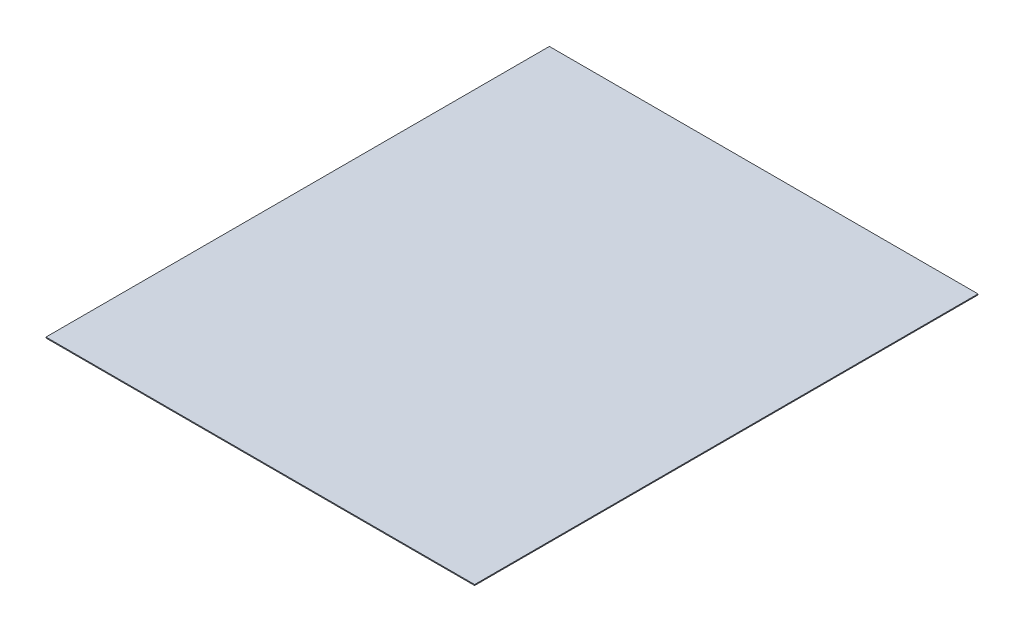
ISO-10303-21;
HEADER;
FILE_DESCRIPTION(('STEP AP214'),'2;1');
FILE_NAME('part.step','',(''),(''),'','','');
FILE_SCHEMA(('AUTOMOTIVE_DESIGN { 1 0 10303 214 1 1 1 1 }'));
ENDSEC;
DATA;
#1=APPLICATION_CONTEXT('core data for automotive mechanical design processes');
#2=APPLICATION_PROTOCOL_DEFINITION('international standard','automotive_design',2000,#1);
#3=PRODUCT_CONTEXT('',#1,'mechanical');
#4=PRODUCT('Part','Part','',(#3));
#5=PRODUCT_RELATED_PRODUCT_CATEGORY('part','',(#4));
#6=PRODUCT_DEFINITION_FORMATION('','',#4);
#7=PRODUCT_DEFINITION_CONTEXT('part definition',#1,'design');
#8=PRODUCT_DEFINITION('design','',#6,#7);
#9=PRODUCT_DEFINITION_SHAPE('','',#8);
#10=(LENGTH_UNIT() NAMED_UNIT(*) SI_UNIT(.MILLI.,.METRE.));
#11=(NAMED_UNIT(*) PLANE_ANGLE_UNIT() SI_UNIT($,.RADIAN.));
#12=(NAMED_UNIT(*) SI_UNIT($,.STERADIAN.) SOLID_ANGLE_UNIT());
#13=UNCERTAINTY_MEASURE_WITH_UNIT(LENGTH_MEASURE(1.E-05),#10,'distance_accuracy_value','');
#14=(GEOMETRIC_REPRESENTATION_CONTEXT(3) GLOBAL_UNCERTAINTY_ASSIGNED_CONTEXT((#13)) GLOBAL_UNIT_ASSIGNED_CONTEXT((#10,
#11,#12)) REPRESENTATION_CONTEXT('',''));
#15=CARTESIAN_POINT('',(0.,0.,0.));
#16=DIRECTION('',(0.,0.,1.));
#17=DIRECTION('',(1.,0.,0.));
#18=AXIS2_PLACEMENT_3D('',#15,#16,#17);
#19=CARTESIAN_POINT('',(1.5,200.,-818.5));
#20=DIRECTION('',(-1.,0.,0.));
#21=DIRECTION('',(0.,0.,1.));
#22=AXIS2_PLACEMENT_3D('',#19,#20,#21);
#23=PLANE('',#22);
#24=DIRECTION('',(0.,-1.,0.));
#25=VECTOR('',#24,1.);
#26=CARTESIAN_POINT('',(1.5,200.,0.));
#27=LINE('',#26,#25);
#28=CARTESIAN_POINT('',(1.5,201.5,0.));
#29=VERTEX_POINT('',#28);
#30=CARTESIAN_POINT('',(1.5,200.,0.));
#31=VERTEX_POINT('',#30);
#32=EDGE_CURVE('E103',#29,#31,#27,.T.);
#33=ORIENTED_EDGE('',*,*,#32,.F.);
#34=DIRECTION('',(0.,0.,1.));
#35=VECTOR('',#34,1.);
#36=CARTESIAN_POINT('',(1.5,201.5,-818.5));
#37=LINE('',#36,#35);
#38=CARTESIAN_POINT('',(1.5,201.5,-818.5));
#39=VERTEX_POINT('',#38);
#40=EDGE_CURVE('E11',#39,#29,#37,.T.);
#41=ORIENTED_EDGE('',*,*,#40,.F.);
#42=DIRECTION('',(0.,-1.,0.));
#43=VECTOR('',#42,1.);
#44=CARTESIAN_POINT('',(1.5,200.,-818.5));
#45=LINE('',#44,#43);
#46=CARTESIAN_POINT('',(1.5,200.,-818.5));
#47=VERTEX_POINT('',#46);
#48=EDGE_CURVE('E97',#39,#47,#45,.T.);
#49=ORIENTED_EDGE('',*,*,#48,.T.);
#50=DIRECTION('',(0.,0.,1.));
#51=VECTOR('',#50,1.);
#52=CARTESIAN_POINT('',(1.5,200.,-818.5));
#53=LINE('',#52,#51);
#54=EDGE_CURVE('E42',#47,#31,#53,.T.);
#55=ORIENTED_EDGE('',*,*,#54,.T.);
#56=EDGE_LOOP('',(#33,#41,#49,#55));
#57=FACE_BOUND('',#56,.T.);
#58=ADVANCED_FACE('F39',(#57),#23,.T.);
#59=CARTESIAN_POINT('',(1.5,201.5,-818.5));
#60=DIRECTION('',(0.,1.,0.));
#61=DIRECTION('',(0.,0.,1.));
#62=AXIS2_PLACEMENT_3D('',#59,#60,#61);
#63=PLANE('',#62);
#64=DIRECTION('',(-1.,0.,0.));
#65=VECTOR('',#64,1.);
#66=CARTESIAN_POINT('',(1.5,201.5,0.));
#67=LINE('',#66,#65);
#68=CARTESIAN_POINT('',(698.5,201.5,0.));
#69=VERTEX_POINT('',#68);
#70=EDGE_CURVE('E99',#69,#29,#67,.T.);
#71=ORIENTED_EDGE('',*,*,#70,.F.);
#72=DIRECTION('',(0.,0.,1.));
#73=VECTOR('',#72,1.);
#74=CARTESIAN_POINT('',(698.5,201.5,-818.5));
#75=LINE('',#74,#73);
#76=CARTESIAN_POINT('',(698.5,201.5,-818.5));
#77=VERTEX_POINT('',#76);
#78=EDGE_CURVE('E48',#77,#69,#75,.T.);
#79=ORIENTED_EDGE('',*,*,#78,.F.);
#80=DIRECTION('',(-1.,0.,0.));
#81=VECTOR('',#80,1.);
#82=CARTESIAN_POINT('',(1.5,201.5,-818.5));
#83=LINE('',#82,#81);
#84=EDGE_CURVE('E94',#77,#39,#83,.T.);
#85=ORIENTED_EDGE('',*,*,#84,.T.);
#86=ORIENTED_EDGE('',*,*,#40,.T.);
#87=EDGE_LOOP('',(#71,#79,#85,#86));
#88=FACE_BOUND('',#87,.T.);
#89=ADVANCED_FACE('F113',(#88),#63,.T.);
#90=CARTESIAN_POINT('',(698.5,200.,-818.5));
#91=DIRECTION('',(1.,0.,0.));
#92=DIRECTION('',(0.,0.,-1.));
#93=AXIS2_PLACEMENT_3D('',#90,#91,#92);
#94=PLANE('',#93);
#95=DIRECTION('',(0.,1.,0.));
#96=VECTOR('',#95,1.);
#97=CARTESIAN_POINT('',(698.5,200.,0.));
#98=LINE('',#97,#96);
#99=CARTESIAN_POINT('',(698.5,200.,0.));
#100=VERTEX_POINT('',#99);
#101=EDGE_CURVE('E89',#100,#69,#98,.T.);
#102=ORIENTED_EDGE('',*,*,#101,.F.);
#103=DIRECTION('',(0.,0.,1.));
#104=VECTOR('',#103,1.);
#105=CARTESIAN_POINT('',(698.5,200.,-818.5));
#106=LINE('',#105,#104);
#107=CARTESIAN_POINT('',(698.5,200.,-818.5));
#108=VERTEX_POINT('',#107);
#109=EDGE_CURVE('E84',#108,#100,#106,.T.);
#110=ORIENTED_EDGE('',*,*,#109,.F.);
#111=DIRECTION('',(0.,1.,0.));
#112=VECTOR('',#111,1.);
#113=CARTESIAN_POINT('',(698.5,200.,-818.5));
#114=LINE('',#113,#112);
#115=EDGE_CURVE('E87',#108,#77,#114,.T.);
#116=ORIENTED_EDGE('',*,*,#115,.T.);
#117=ORIENTED_EDGE('',*,*,#78,.T.);
#118=EDGE_LOOP('',(#102,#110,#116,#117));
#119=FACE_BOUND('',#118,.T.);
#120=ADVANCED_FACE('F86',(#119),#94,.T.);
#121=CARTESIAN_POINT('',(1.5,200.,-818.5));
#122=DIRECTION('',(0.,-1.,0.));
#123=DIRECTION('',(0.,0.,-1.));
#124=AXIS2_PLACEMENT_3D('',#121,#122,#123);
#125=PLANE('',#124);
#126=DIRECTION('',(1.,0.,0.));
#127=VECTOR('',#126,1.);
#128=CARTESIAN_POINT('',(1.5,200.,0.));
#129=LINE('',#128,#127);
#130=EDGE_CURVE('E106',#31,#100,#129,.T.);
#131=ORIENTED_EDGE('',*,*,#130,.F.);
#132=ORIENTED_EDGE('',*,*,#54,.F.);
#133=DIRECTION('',(1.,0.,0.));
#134=VECTOR('',#133,1.);
#135=CARTESIAN_POINT('',(1.5,200.,-818.5));
#136=LINE('',#135,#134);
#137=EDGE_CURVE('E93',#47,#108,#136,.T.);
#138=ORIENTED_EDGE('',*,*,#137,.T.);
#139=ORIENTED_EDGE('',*,*,#109,.T.);
#140=EDGE_LOOP('',(#131,#132,#138,#139));
#141=FACE_BOUND('',#140,.T.);
#142=ADVANCED_FACE('F96',(#141),#125,.T.);
#143=CARTESIAN_POINT('',(0.,0.,-818.5));
#144=DIRECTION('',(0.,0.,-1.));
#145=DIRECTION('',(-1.,0.,0.));
#146=AXIS2_PLACEMENT_3D('',#143,#144,#145);
#147=PLANE('',#146);
#148=ORIENTED_EDGE('',*,*,#48,.F.);
#149=ORIENTED_EDGE('',*,*,#84,.F.);
#150=ORIENTED_EDGE('',*,*,#115,.F.);
#151=ORIENTED_EDGE('',*,*,#137,.F.);
#152=EDGE_LOOP('',(#148,#149,#150,#151));
#153=FACE_BOUND('',#152,.T.);
#154=ADVANCED_FACE('F92',(#153),#147,.T.);
#155=CARTESIAN_POINT('',(0.,0.,0.));
#156=DIRECTION('',(0.,0.,-1.));
#157=DIRECTION('',(-1.,0.,0.));
#158=AXIS2_PLACEMENT_3D('',#155,#156,#157);
#159=PLANE('',#158);
#160=ORIENTED_EDGE('',*,*,#32,.T.);
#161=ORIENTED_EDGE('',*,*,#130,.T.);
#162=ORIENTED_EDGE('',*,*,#101,.T.);
#163=ORIENTED_EDGE('',*,*,#70,.T.);
#164=EDGE_LOOP('',(#160,#161,#162,#163));
#165=FACE_BOUND('',#164,.T.);
#166=ADVANCED_FACE('F112',(#165),#159,.F.);
#167=CLOSED_SHELL('',(#58,#89,#120,#142,#154,#166));
#168=MANIFOLD_SOLID_BREP('B2',#167);
#169=ADVANCED_BREP_SHAPE_REPRESENTATION('',(#18,#168),#14);
#170=SHAPE_DEFINITION_REPRESENTATION(#9,#169);
ENDSEC;
END-ISO-10303-21;
